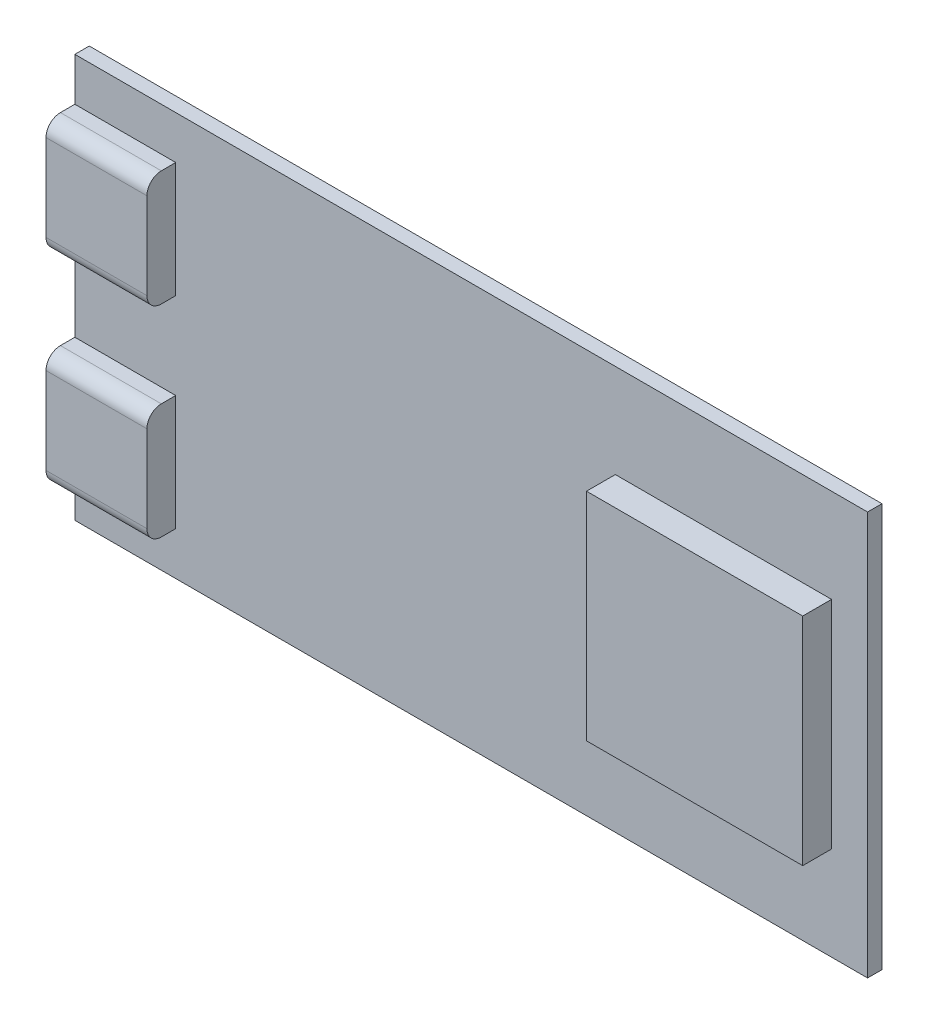
ISO-10303-21;
HEADER;
FILE_DESCRIPTION(('STEP AP214'),'2;1');
FILE_NAME('part.step','',(''),(''),'','','');
FILE_SCHEMA(('AUTOMOTIVE_DESIGN { 1 0 10303 214 1 1 1 1 }'));
ENDSEC;
DATA;
#1=APPLICATION_CONTEXT('core data for automotive mechanical design processes');
#2=APPLICATION_PROTOCOL_DEFINITION('international standard','automotive_design',2000,#1);
#3=PRODUCT_CONTEXT('',#1,'mechanical');
#4=PRODUCT('Part','Part','',(#3));
#5=PRODUCT_RELATED_PRODUCT_CATEGORY('part','',(#4));
#6=PRODUCT_DEFINITION_FORMATION('','',#4);
#7=PRODUCT_DEFINITION_CONTEXT('part definition',#1,'design');
#8=PRODUCT_DEFINITION('design','',#6,#7);
#9=PRODUCT_DEFINITION_SHAPE('','',#8);
#10=(LENGTH_UNIT() NAMED_UNIT(*) SI_UNIT(.MILLI.,.METRE.));
#11=(NAMED_UNIT(*) PLANE_ANGLE_UNIT() SI_UNIT($,.RADIAN.));
#12=(NAMED_UNIT(*) SI_UNIT($,.STERADIAN.) SOLID_ANGLE_UNIT());
#13=UNCERTAINTY_MEASURE_WITH_UNIT(LENGTH_MEASURE(1.E-05),#10,'distance_accuracy_value','');
#14=(GEOMETRIC_REPRESENTATION_CONTEXT(3) GLOBAL_UNCERTAINTY_ASSIGNED_CONTEXT((#13)) GLOBAL_UNIT_ASSIGNED_CONTEXT((#10,
#11,#12)) REPRESENTATION_CONTEXT('',''));
#15=CARTESIAN_POINT('',(0.,0.,0.));
#16=DIRECTION('',(0.,0.,1.));
#17=DIRECTION('',(1.,0.,0.));
#18=AXIS2_PLACEMENT_3D('',#15,#16,#17);
#19=CARTESIAN_POINT('',(0.,0.,1.));
#20=DIRECTION('',(0.,0.,1.));
#21=DIRECTION('',(1.,0.,0.));
#22=AXIS2_PLACEMENT_3D('',#19,#20,#21);
#23=PLANE('',#22);
#24=DIRECTION('',(1.,0.,0.));
#25=VECTOR('',#24,1.);
#26=CARTESIAN_POINT('',(25.,-7.5,1.));
#27=LINE('',#26,#25);
#28=CARTESIAN_POINT('',(9.99999999999999,-7.5,1.));
#29=VERTEX_POINT('',#28);
#30=CARTESIAN_POINT('',(25.,-7.5,1.));
#31=VERTEX_POINT('',#30);
#32=EDGE_CURVE('E255',#29,#31,#27,.T.);
#33=ORIENTED_EDGE('',*,*,#32,.F.);
#34=DIRECTION('',(0.,-1.,0.));
#35=VECTOR('',#34,1.);
#36=CARTESIAN_POINT('',(9.99999999999999,-7.5,1.));
#37=LINE('',#36,#35);
#38=CARTESIAN_POINT('',(9.99999999999999,7.5,1.));
#39=VERTEX_POINT('',#38);
#40=EDGE_CURVE('E241',#39,#29,#37,.T.);
#41=ORIENTED_EDGE('',*,*,#40,.F.);
#42=DIRECTION('',(-1.,0.,0.));
#43=VECTOR('',#42,1.);
#44=CARTESIAN_POINT('',(25.,7.5,1.));
#45=LINE('',#44,#43);
#46=CARTESIAN_POINT('',(25.,7.5,1.));
#47=VERTEX_POINT('',#46);
#48=EDGE_CURVE('E246',#47,#39,#45,.T.);
#49=ORIENTED_EDGE('',*,*,#48,.F.);
#50=DIRECTION('',(0.,1.,0.));
#51=VECTOR('',#50,1.);
#52=CARTESIAN_POINT('',(25.,-7.5,1.));
#53=LINE('',#52,#51);
#54=EDGE_CURVE('E257',#31,#47,#53,.T.);
#55=ORIENTED_EDGE('',*,*,#54,.F.);
#56=EDGE_LOOP('',(#33,#41,#49,#55));
#57=FACE_BOUND('',#56,.T.);
#58=DIRECTION('',(0.,-1.,0.));
#59=VECTOR('',#58,1.);
#60=CARTESIAN_POINT('',(-27.5,-14.,1.));
#61=LINE('',#60,#59);
#62=CARTESIAN_POINT('',(-27.5,3.,1.));
#63=VERTEX_POINT('',#62);
#64=CARTESIAN_POINT('',(-27.5,-3.,1.));
#65=VERTEX_POINT('',#64);
#66=EDGE_CURVE('E196',#63,#65,#61,.T.);
#67=ORIENTED_EDGE('',*,*,#66,.T.);
#68=DIRECTION('',(-1.,0.,0.));
#69=VECTOR('',#68,1.);
#70=CARTESIAN_POINT('',(-20.5,-3.,1.));
#71=LINE('',#70,#69);
#72=CARTESIAN_POINT('',(-20.5,-3.,1.));
#73=VERTEX_POINT('',#72);
#74=EDGE_CURVE('E205',#73,#65,#71,.T.);
#75=ORIENTED_EDGE('',*,*,#74,.F.);
#76=DIRECTION('',(0.,1.,0.));
#77=VECTOR('',#76,1.);
#78=CARTESIAN_POINT('',(-20.5,-3.,1.));
#79=LINE('',#78,#77);
#80=CARTESIAN_POINT('',(-20.5,-11.,1.));
#81=VERTEX_POINT('',#80);
#82=EDGE_CURVE('E204',#81,#73,#79,.T.);
#83=ORIENTED_EDGE('',*,*,#82,.F.);
#84=DIRECTION('',(1.,0.,0.));
#85=VECTOR('',#84,1.);
#86=CARTESIAN_POINT('',(-20.5,-11.,1.));
#87=LINE('',#86,#85);
#88=CARTESIAN_POINT('',(-27.5,-11.,1.));
#89=VERTEX_POINT('',#88);
#90=EDGE_CURVE('E180',#89,#81,#87,.T.);
#91=ORIENTED_EDGE('',*,*,#90,.F.);
#92=CARTESIAN_POINT('',(-27.5,-14.,1.));
#93=VERTEX_POINT('',#92);
#94=EDGE_CURVE('E189',#89,#93,#61,.T.);
#95=ORIENTED_EDGE('',*,*,#94,.T.);
#96=DIRECTION('',(1.,0.,0.));
#97=VECTOR('',#96,1.);
#98=CARTESIAN_POINT('',(27.5,-14.,1.));
#99=LINE('',#98,#97);
#100=CARTESIAN_POINT('',(27.5,-14.,1.));
#101=VERTEX_POINT('',#100);
#102=EDGE_CURVE('E272',#93,#101,#99,.T.);
#103=ORIENTED_EDGE('',*,*,#102,.T.);
#104=DIRECTION('',(0.,1.,0.));
#105=VECTOR('',#104,1.);
#106=CARTESIAN_POINT('',(27.5,-14.,1.));
#107=LINE('',#106,#105);
#108=CARTESIAN_POINT('',(27.5,14.,1.));
#109=VERTEX_POINT('',#108);
#110=EDGE_CURVE('E274',#101,#109,#107,.T.);
#111=ORIENTED_EDGE('',*,*,#110,.T.);
#112=DIRECTION('',(-1.,0.,0.));
#113=VECTOR('',#112,1.);
#114=CARTESIAN_POINT('',(27.5,14.,1.));
#115=LINE('',#114,#113);
#116=CARTESIAN_POINT('',(-27.5,14.,1.));
#117=VERTEX_POINT('',#116);
#118=EDGE_CURVE('E276',#109,#117,#115,.T.);
#119=ORIENTED_EDGE('',*,*,#118,.T.);
#120=CARTESIAN_POINT('',(-27.5,11.,1.));
#121=VERTEX_POINT('',#120);
#122=EDGE_CURVE('E199',#117,#121,#61,.T.);
#123=ORIENTED_EDGE('',*,*,#122,.T.);
#124=DIRECTION('',(-1.,0.,0.));
#125=VECTOR('',#124,1.);
#126=CARTESIAN_POINT('',(-20.5,11.,1.));
#127=LINE('',#126,#125);
#128=CARTESIAN_POINT('',(-20.5,11.,1.));
#129=VERTEX_POINT('',#128);
#130=EDGE_CURVE('E223',#129,#121,#127,.T.);
#131=ORIENTED_EDGE('',*,*,#130,.F.);
#132=DIRECTION('',(0.,1.,0.));
#133=VECTOR('',#132,1.);
#134=CARTESIAN_POINT('',(-20.5,3.,1.));
#135=LINE('',#134,#133);
#136=CARTESIAN_POINT('',(-20.5,3.,1.));
#137=VERTEX_POINT('',#136);
#138=EDGE_CURVE('E229',#137,#129,#135,.T.);
#139=ORIENTED_EDGE('',*,*,#138,.F.);
#140=DIRECTION('',(1.,0.,0.));
#141=VECTOR('',#140,1.);
#142=CARTESIAN_POINT('',(-20.5,3.,1.));
#143=LINE('',#142,#141);
#144=EDGE_CURVE('E216',#63,#137,#143,.T.);
#145=ORIENTED_EDGE('',*,*,#144,.F.);
#146=EDGE_LOOP('',(#67,#75,#83,#91,#95,#103,#111,#119,#123,#131,#139,#145));
#147=FACE_BOUND('',#146,.T.);
#148=ADVANCED_FACE('F39',(#57,#147),#23,.T.);
#149=CARTESIAN_POINT('',(-27.5,-14.,1.));
#150=DIRECTION('',(1.,0.,0.));
#151=DIRECTION('',(0.,0.,-1.));
#152=AXIS2_PLACEMENT_3D('',#149,#150,#151);
#153=PLANE('',#152);
#154=DIRECTION('',(0.,0.,-1.));
#155=VECTOR('',#154,1.);
#156=CARTESIAN_POINT('',(-27.5,-11.,3.));
#157=LINE('',#156,#155);
#158=CARTESIAN_POINT('',(-27.5,-11.,2.));
#159=VERTEX_POINT('',#158);
#160=EDGE_CURVE('E175',#159,#89,#157,.T.);
#161=ORIENTED_EDGE('',*,*,#160,.F.);
#162=CARTESIAN_POINT('',(-27.5,-10.,2.));
#163=DIRECTION('',(1.,0.,0.));
#164=DIRECTION('',(0.,0.,-1.));
#165=AXIS2_PLACEMENT_3D('',#162,#163,#164);
#166=CIRCLE('',#165,1.);
#167=CARTESIAN_POINT('',(-27.5,-10.,3.));
#168=VERTEX_POINT('',#167);
#169=EDGE_CURVE('E311',#159,#168,#166,.F.);
#170=ORIENTED_EDGE('',*,*,#169,.T.);
#171=DIRECTION('',(0.,-1.,0.));
#172=VECTOR('',#171,1.);
#173=CARTESIAN_POINT('',(-27.5,-3.,3.));
#174=LINE('',#173,#172);
#175=CARTESIAN_POINT('',(-27.5,-4.,3.));
#176=VERTEX_POINT('',#175);
#177=EDGE_CURVE('E211',#176,#168,#174,.T.);
#178=ORIENTED_EDGE('',*,*,#177,.F.);
#179=CARTESIAN_POINT('',(-27.5,-4.,2.));
#180=DIRECTION('',(1.,0.,0.));
#181=DIRECTION('',(0.,0.,-1.));
#182=AXIS2_PLACEMENT_3D('',#179,#180,#181);
#183=CIRCLE('',#182,1.);
#184=CARTESIAN_POINT('',(-27.5,-3.,2.));
#185=VERTEX_POINT('',#184);
#186=EDGE_CURVE('E309',#176,#185,#183,.F.);
#187=ORIENTED_EDGE('',*,*,#186,.T.);
#188=DIRECTION('',(0.,0.,-1.));
#189=VECTOR('',#188,1.);
#190=CARTESIAN_POINT('',(-27.5,-3.,3.));
#191=LINE('',#190,#189);
#192=EDGE_CURVE('E186',#185,#65,#191,.T.);
#193=ORIENTED_EDGE('',*,*,#192,.T.);
#194=ORIENTED_EDGE('',*,*,#66,.F.);
#195=DIRECTION('',(0.,0.,-1.));
#196=VECTOR('',#195,1.);
#197=CARTESIAN_POINT('',(-27.5,3.,3.));
#198=LINE('',#197,#196);
#199=CARTESIAN_POINT('',(-27.5,3.,2.));
#200=VERTEX_POINT('',#199);
#201=EDGE_CURVE('E239',#200,#63,#198,.T.);
#202=ORIENTED_EDGE('',*,*,#201,.F.);
#203=CARTESIAN_POINT('',(-27.5,4.,2.));
#204=DIRECTION('',(1.,0.,0.));
#205=DIRECTION('',(0.,0.,-1.));
#206=AXIS2_PLACEMENT_3D('',#203,#204,#205);
#207=CIRCLE('',#206,1.);
#208=CARTESIAN_POINT('',(-27.5,4.,3.));
#209=VERTEX_POINT('',#208);
#210=EDGE_CURVE('E307',#200,#209,#207,.F.);
#211=ORIENTED_EDGE('',*,*,#210,.T.);
#212=DIRECTION('',(0.,-1.,0.));
#213=VECTOR('',#212,1.);
#214=CARTESIAN_POINT('',(-27.5,3.,3.));
#215=LINE('',#214,#213);
#216=CARTESIAN_POINT('',(-27.5,10.,3.));
#217=VERTEX_POINT('',#216);
#218=EDGE_CURVE('E219',#217,#209,#215,.T.);
#219=ORIENTED_EDGE('',*,*,#218,.F.);
#220=CARTESIAN_POINT('',(-27.5,10.,2.));
#221=DIRECTION('',(1.,0.,0.));
#222=DIRECTION('',(0.,0.,-1.));
#223=AXIS2_PLACEMENT_3D('',#220,#221,#222);
#224=CIRCLE('',#223,1.);
#225=CARTESIAN_POINT('',(-27.5,11.,2.));
#226=VERTEX_POINT('',#225);
#227=EDGE_CURVE('E305',#217,#226,#224,.F.);
#228=ORIENTED_EDGE('',*,*,#227,.T.);
#229=DIRECTION('',(0.,0.,-1.));
#230=VECTOR('',#229,1.);
#231=CARTESIAN_POINT('',(-27.5,11.,3.));
#232=LINE('',#231,#230);
#233=EDGE_CURVE('E226',#226,#121,#232,.T.);
#234=ORIENTED_EDGE('',*,*,#233,.T.);
#235=ORIENTED_EDGE('',*,*,#122,.F.);
#236=DIRECTION('',(0.,0.,-1.));
#237=VECTOR('',#236,1.);
#238=CARTESIAN_POINT('',(-27.5,14.,1.));
#239=LINE('',#238,#237);
#240=CARTESIAN_POINT('',(-27.5,14.,0.));
#241=VERTEX_POINT('',#240);
#242=EDGE_CURVE('E278',#117,#241,#239,.T.);
#243=ORIENTED_EDGE('',*,*,#242,.T.);
#244=DIRECTION('',(0.,-1.,0.));
#245=VECTOR('',#244,1.);
#246=CARTESIAN_POINT('',(-27.5,-14.,0.));
#247=LINE('',#246,#245);
#248=CARTESIAN_POINT('',(-27.5,-14.,0.));
#249=VERTEX_POINT('',#248);
#250=EDGE_CURVE('E269',#241,#249,#247,.T.);
#251=ORIENTED_EDGE('',*,*,#250,.T.);
#252=DIRECTION('',(0.,0.,-1.));
#253=VECTOR('',#252,1.);
#254=CARTESIAN_POINT('',(-27.5,-14.,1.));
#255=LINE('',#254,#253);
#256=EDGE_CURVE('E193',#93,#249,#255,.T.);
#257=ORIENTED_EDGE('',*,*,#256,.F.);
#258=ORIENTED_EDGE('',*,*,#94,.F.);
#259=EDGE_LOOP('',(#161,#170,#178,#187,#193,#194,#202,#211,#219,#228,#234,#235,#243,#251,#257,#258));
#260=FACE_BOUND('',#259,.T.);
#261=ADVANCED_FACE('F190',(#260),#153,.F.);
#262=CARTESIAN_POINT('',(27.5,-14.,1.));
#263=DIRECTION('',(0.,1.,0.));
#264=DIRECTION('',(-1.,0.,0.));
#265=AXIS2_PLACEMENT_3D('',#262,#263,#264);
#266=PLANE('',#265);
#267=DIRECTION('',(1.,0.,0.));
#268=VECTOR('',#267,1.);
#269=CARTESIAN_POINT('',(27.5,-14.,0.));
#270=LINE('',#269,#268);
#271=CARTESIAN_POINT('',(27.5,-14.,0.));
#272=VERTEX_POINT('',#271);
#273=EDGE_CURVE('E280',#249,#272,#270,.T.);
#274=ORIENTED_EDGE('',*,*,#273,.T.);
#275=DIRECTION('',(0.,0.,-1.));
#276=VECTOR('',#275,1.);
#277=CARTESIAN_POINT('',(27.5,-14.,1.));
#278=LINE('',#277,#276);
#279=EDGE_CURVE('E290',#101,#272,#278,.T.);
#280=ORIENTED_EDGE('',*,*,#279,.F.);
#281=ORIENTED_EDGE('',*,*,#102,.F.);
#282=ORIENTED_EDGE('',*,*,#256,.T.);
#283=EDGE_LOOP('',(#274,#280,#281,#282));
#284=FACE_BOUND('',#283,.T.);
#285=ADVANCED_FACE('F354',(#284),#266,.F.);
#286=CARTESIAN_POINT('',(27.5,-14.,1.));
#287=DIRECTION('',(-1.,0.,0.));
#288=DIRECTION('',(0.,0.,1.));
#289=AXIS2_PLACEMENT_3D('',#286,#287,#288);
#290=PLANE('',#289);
#291=DIRECTION('',(0.,1.,0.));
#292=VECTOR('',#291,1.);
#293=CARTESIAN_POINT('',(27.5,-14.,0.));
#294=LINE('',#293,#292);
#295=CARTESIAN_POINT('',(27.5,14.,0.));
#296=VERTEX_POINT('',#295);
#297=EDGE_CURVE('E282',#272,#296,#294,.T.);
#298=ORIENTED_EDGE('',*,*,#297,.T.);
#299=DIRECTION('',(0.,0.,-1.));
#300=VECTOR('',#299,1.);
#301=CARTESIAN_POINT('',(27.5,14.,1.));
#302=LINE('',#301,#300);
#303=EDGE_CURVE('E287',#109,#296,#302,.T.);
#304=ORIENTED_EDGE('',*,*,#303,.F.);
#305=ORIENTED_EDGE('',*,*,#110,.F.);
#306=ORIENTED_EDGE('',*,*,#279,.T.);
#307=EDGE_LOOP('',(#298,#304,#305,#306));
#308=FACE_BOUND('',#307,.T.);
#309=ADVANCED_FACE('F358',(#308),#290,.F.);
#310=CARTESIAN_POINT('',(27.5,14.,1.));
#311=DIRECTION('',(0.,-1.,0.));
#312=DIRECTION('',(1.,0.,0.));
#313=AXIS2_PLACEMENT_3D('',#310,#311,#312);
#314=PLANE('',#313);
#315=DIRECTION('',(-1.,0.,0.));
#316=VECTOR('',#315,1.);
#317=CARTESIAN_POINT('',(27.5,14.,0.));
#318=LINE('',#317,#316);
#319=EDGE_CURVE('E197',#296,#241,#318,.T.);
#320=ORIENTED_EDGE('',*,*,#319,.T.);
#321=ORIENTED_EDGE('',*,*,#242,.F.);
#322=ORIENTED_EDGE('',*,*,#118,.F.);
#323=ORIENTED_EDGE('',*,*,#303,.T.);
#324=EDGE_LOOP('',(#320,#321,#322,#323));
#325=FACE_BOUND('',#324,.T.);
#326=ADVANCED_FACE('F359',(#325),#314,.F.);
#327=CARTESIAN_POINT('',(0.,0.,0.));
#328=DIRECTION('',(0.,0.,1.));
#329=DIRECTION('',(1.,0.,0.));
#330=AXIS2_PLACEMENT_3D('',#327,#328,#329);
#331=PLANE('',#330);
#332=ORIENTED_EDGE('',*,*,#250,.F.);
#333=ORIENTED_EDGE('',*,*,#319,.F.);
#334=ORIENTED_EDGE('',*,*,#297,.F.);
#335=ORIENTED_EDGE('',*,*,#273,.F.);
#336=EDGE_LOOP('',(#332,#333,#334,#335));
#337=FACE_BOUND('',#336,.T.);
#338=ADVANCED_FACE('F350',(#337),#331,.F.);
#339=CARTESIAN_POINT('',(9.99999999999999,-7.5,3.));
#340=DIRECTION('',(1.,0.,0.));
#341=DIRECTION('',(0.,0.,-1.));
#342=AXIS2_PLACEMENT_3D('',#339,#340,#341);
#343=PLANE('',#342);
#344=ORIENTED_EDGE('',*,*,#40,.T.);
#345=DIRECTION('',(0.,0.,-1.));
#346=VECTOR('',#345,1.);
#347=CARTESIAN_POINT('',(9.99999999999999,-7.5,3.));
#348=LINE('',#347,#346);
#349=CARTESIAN_POINT('',(9.99999999999999,-7.5,3.));
#350=VERTEX_POINT('',#349);
#351=EDGE_CURVE('E268',#350,#29,#348,.T.);
#352=ORIENTED_EDGE('',*,*,#351,.F.);
#353=DIRECTION('',(0.,-1.,0.));
#354=VECTOR('',#353,1.);
#355=CARTESIAN_POINT('',(9.99999999999999,-7.5,3.));
#356=LINE('',#355,#354);
#357=CARTESIAN_POINT('',(9.99999999999999,7.5,3.));
#358=VERTEX_POINT('',#357);
#359=EDGE_CURVE('E242',#358,#350,#356,.T.);
#360=ORIENTED_EDGE('',*,*,#359,.F.);
#361=DIRECTION('',(0.,0.,-1.));
#362=VECTOR('',#361,1.);
#363=CARTESIAN_POINT('',(9.99999999999999,7.5,3.));
#364=LINE('',#363,#362);
#365=EDGE_CURVE('E252',#358,#39,#364,.T.);
#366=ORIENTED_EDGE('',*,*,#365,.T.);
#367=EDGE_LOOP('',(#344,#352,#360,#366));
#368=FACE_BOUND('',#367,.T.);
#369=ADVANCED_FACE('F366',(#368),#343,.F.);
#370=CARTESIAN_POINT('',(25.,-7.5,3.));
#371=DIRECTION('',(0.,1.,0.));
#372=DIRECTION('',(-1.,0.,0.));
#373=AXIS2_PLACEMENT_3D('',#370,#371,#372);
#374=PLANE('',#373);
#375=ORIENTED_EDGE('',*,*,#32,.T.);
#376=DIRECTION('',(0.,0.,-1.));
#377=VECTOR('',#376,1.);
#378=CARTESIAN_POINT('',(25.,-7.5,3.));
#379=LINE('',#378,#377);
#380=CARTESIAN_POINT('',(25.,-7.5,3.));
#381=VERTEX_POINT('',#380);
#382=EDGE_CURVE('E265',#381,#31,#379,.T.);
#383=ORIENTED_EDGE('',*,*,#382,.F.);
#384=DIRECTION('',(1.,0.,0.));
#385=VECTOR('',#384,1.);
#386=CARTESIAN_POINT('',(25.,-7.5,3.));
#387=LINE('',#386,#385);
#388=EDGE_CURVE('E245',#350,#381,#387,.T.);
#389=ORIENTED_EDGE('',*,*,#388,.F.);
#390=ORIENTED_EDGE('',*,*,#351,.T.);
#391=EDGE_LOOP('',(#375,#383,#389,#390));
#392=FACE_BOUND('',#391,.T.);
#393=ADVANCED_FACE('F380',(#392),#374,.F.);
#394=CARTESIAN_POINT('',(25.,-7.5,3.));
#395=DIRECTION('',(-1.,0.,0.));
#396=DIRECTION('',(0.,0.,1.));
#397=AXIS2_PLACEMENT_3D('',#394,#395,#396);
#398=PLANE('',#397);
#399=ORIENTED_EDGE('',*,*,#54,.T.);
#400=DIRECTION('',(0.,0.,-1.));
#401=VECTOR('',#400,1.);
#402=CARTESIAN_POINT('',(25.,7.5,3.));
#403=LINE('',#402,#401);
#404=CARTESIAN_POINT('',(25.,7.5,3.));
#405=VERTEX_POINT('',#404);
#406=EDGE_CURVE('E263',#405,#47,#403,.T.);
#407=ORIENTED_EDGE('',*,*,#406,.F.);
#408=DIRECTION('',(0.,1.,0.));
#409=VECTOR('',#408,1.);
#410=CARTESIAN_POINT('',(25.,-7.5,3.));
#411=LINE('',#410,#409);
#412=EDGE_CURVE('E248',#381,#405,#411,.T.);
#413=ORIENTED_EDGE('',*,*,#412,.F.);
#414=ORIENTED_EDGE('',*,*,#382,.T.);
#415=EDGE_LOOP('',(#399,#407,#413,#414));
#416=FACE_BOUND('',#415,.T.);
#417=ADVANCED_FACE('F384',(#416),#398,.F.);
#418=CARTESIAN_POINT('',(25.,7.5,3.));
#419=DIRECTION('',(0.,-1.,0.));
#420=DIRECTION('',(1.,0.,0.));
#421=AXIS2_PLACEMENT_3D('',#418,#419,#420);
#422=PLANE('',#421);
#423=ORIENTED_EDGE('',*,*,#48,.T.);
#424=ORIENTED_EDGE('',*,*,#365,.F.);
#425=DIRECTION('',(-1.,0.,0.));
#426=VECTOR('',#425,1.);
#427=CARTESIAN_POINT('',(25.,7.5,3.));
#428=LINE('',#427,#426);
#429=EDGE_CURVE('E250',#405,#358,#428,.T.);
#430=ORIENTED_EDGE('',*,*,#429,.F.);
#431=ORIENTED_EDGE('',*,*,#406,.T.);
#432=EDGE_LOOP('',(#423,#424,#430,#431));
#433=FACE_BOUND('',#432,.T.);
#434=ADVANCED_FACE('F388',(#433),#422,.F.);
#435=CARTESIAN_POINT('',(0.,0.,3.));
#436=DIRECTION('',(0.,0.,1.));
#437=DIRECTION('',(1.,0.,0.));
#438=AXIS2_PLACEMENT_3D('',#435,#436,#437);
#439=PLANE('',#438);
#440=ORIENTED_EDGE('',*,*,#359,.T.);
#441=ORIENTED_EDGE('',*,*,#388,.T.);
#442=ORIENTED_EDGE('',*,*,#412,.T.);
#443=ORIENTED_EDGE('',*,*,#429,.T.);
#444=EDGE_LOOP('',(#440,#441,#442,#443));
#445=FACE_BOUND('',#444,.T.);
#446=ADVANCED_FACE('F392',(#445),#439,.T.);
#447=CARTESIAN_POINT('',(-20.5,3.,3.));
#448=DIRECTION('',(0.,1.,0.));
#449=DIRECTION('',(-1.,0.,0.));
#450=AXIS2_PLACEMENT_3D('',#447,#448,#449);
#451=PLANE('',#450);
#452=DIRECTION('',(0.,0.,-1.));
#453=VECTOR('',#452,1.);
#454=CARTESIAN_POINT('',(-20.5,3.,3.));
#455=LINE('',#454,#453);
#456=CARTESIAN_POINT('',(-20.5,3.,2.));
#457=VERTEX_POINT('',#456);
#458=EDGE_CURVE('E237',#457,#137,#455,.T.);
#459=ORIENTED_EDGE('',*,*,#458,.F.);
#460=DIRECTION('',(1.,0.,0.));
#461=VECTOR('',#460,1.);
#462=CARTESIAN_POINT('',(-27.5,3.,2.));
#463=LINE('',#462,#461);
#464=EDGE_CURVE('E47',#457,#200,#463,.F.);
#465=ORIENTED_EDGE('',*,*,#464,.T.);
#466=ORIENTED_EDGE('',*,*,#201,.T.);
#467=ORIENTED_EDGE('',*,*,#144,.T.);
#468=EDGE_LOOP('',(#459,#465,#466,#467));
#469=FACE_BOUND('',#468,.T.);
#470=ADVANCED_FACE('F326',(#469),#451,.F.);
#471=CARTESIAN_POINT('',(-20.5,3.,3.));
#472=DIRECTION('',(-1.,0.,0.));
#473=DIRECTION('',(0.,0.,1.));
#474=AXIS2_PLACEMENT_3D('',#471,#472,#473);
#475=PLANE('',#474);
#476=DIRECTION('',(0.,1.,0.));
#477=VECTOR('',#476,1.);
#478=CARTESIAN_POINT('',(-20.5,3.,3.));
#479=LINE('',#478,#477);
#480=CARTESIAN_POINT('',(-20.5,4.,3.));
#481=VERTEX_POINT('',#480);
#482=CARTESIAN_POINT('',(-20.5,10.,3.));
#483=VERTEX_POINT('',#482);
#484=EDGE_CURVE('E222',#481,#483,#479,.T.);
#485=ORIENTED_EDGE('',*,*,#484,.F.);
#486=CARTESIAN_POINT('',(-20.5,4.,2.));
#487=DIRECTION('',(-1.,0.,0.));
#488=DIRECTION('',(0.,0.,1.));
#489=AXIS2_PLACEMENT_3D('',#486,#487,#488);
#490=CIRCLE('',#489,1.);
#491=EDGE_CURVE('E54',#481,#457,#490,.F.);
#492=ORIENTED_EDGE('',*,*,#491,.T.);
#493=ORIENTED_EDGE('',*,*,#458,.T.);
#494=ORIENTED_EDGE('',*,*,#138,.T.);
#495=DIRECTION('',(0.,0.,-1.));
#496=VECTOR('',#495,1.);
#497=CARTESIAN_POINT('',(-20.5,11.,3.));
#498=LINE('',#497,#496);
#499=CARTESIAN_POINT('',(-20.5,11.,2.));
#500=VERTEX_POINT('',#499);
#501=EDGE_CURVE('E235',#500,#129,#498,.T.);
#502=ORIENTED_EDGE('',*,*,#501,.F.);
#503=CARTESIAN_POINT('',(-20.5,10.,2.));
#504=DIRECTION('',(-1.,0.,0.));
#505=DIRECTION('',(0.,0.,1.));
#506=AXIS2_PLACEMENT_3D('',#503,#504,#505);
#507=CIRCLE('',#506,1.);
#508=EDGE_CURVE('E321',#500,#483,#507,.F.);
#509=ORIENTED_EDGE('',*,*,#508,.T.);
#510=EDGE_LOOP('',(#485,#492,#493,#494,#502,#509));
#511=FACE_BOUND('',#510,.T.);
#512=ADVANCED_FACE('F337',(#511),#475,.F.);
#513=CARTESIAN_POINT('',(-20.5,11.,3.));
#514=DIRECTION('',(0.,-1.,0.));
#515=DIRECTION('',(1.,0.,0.));
#516=AXIS2_PLACEMENT_3D('',#513,#514,#515);
#517=PLANE('',#516);
#518=ORIENTED_EDGE('',*,*,#233,.F.);
#519=DIRECTION('',(-1.,0.,0.));
#520=VECTOR('',#519,1.);
#521=CARTESIAN_POINT('',(-20.5,11.,2.));
#522=LINE('',#521,#520);
#523=EDGE_CURVE('E11',#226,#500,#522,.F.);
#524=ORIENTED_EDGE('',*,*,#523,.T.);
#525=ORIENTED_EDGE('',*,*,#501,.T.);
#526=ORIENTED_EDGE('',*,*,#130,.T.);
#527=EDGE_LOOP('',(#518,#524,#525,#526));
#528=FACE_BOUND('',#527,.T.);
#529=ADVANCED_FACE('F341',(#528),#517,.F.);
#530=CARTESIAN_POINT('',(0.,0.,3.));
#531=DIRECTION('',(0.,0.,1.));
#532=DIRECTION('',(1.,0.,0.));
#533=AXIS2_PLACEMENT_3D('',#530,#531,#532);
#534=PLANE('',#533);
#535=ORIENTED_EDGE('',*,*,#218,.T.);
#536=DIRECTION('',(1.,0.,0.));
#537=VECTOR('',#536,1.);
#538=CARTESIAN_POINT('',(-20.5,4.,3.));
#539=LINE('',#538,#537);
#540=EDGE_CURVE('E318',#209,#481,#539,.T.);
#541=ORIENTED_EDGE('',*,*,#540,.T.);
#542=ORIENTED_EDGE('',*,*,#484,.T.);
#543=DIRECTION('',(-1.,0.,0.));
#544=VECTOR('',#543,1.);
#545=CARTESIAN_POINT('',(-27.5,10.,3.));
#546=LINE('',#545,#544);
#547=EDGE_CURVE('E315',#483,#217,#546,.T.);
#548=ORIENTED_EDGE('',*,*,#547,.T.);
#549=EDGE_LOOP('',(#535,#541,#542,#548));
#550=FACE_BOUND('',#549,.T.);
#551=ADVANCED_FACE('F335',(#550),#534,.T.);
#552=CARTESIAN_POINT('',(-20.5,-3.,3.));
#553=DIRECTION('',(-1.,0.,0.));
#554=DIRECTION('',(0.,-1.,0.));
#555=AXIS2_PLACEMENT_3D('',#552,#553,#554);
#556=PLANE('',#555);
#557=DIRECTION('',(0.,1.,0.));
#558=VECTOR('',#557,1.);
#559=CARTESIAN_POINT('',(-20.5,-3.,3.));
#560=LINE('',#559,#558);
#561=CARTESIAN_POINT('',(-20.5,-10.,3.));
#562=VERTEX_POINT('',#561);
#563=CARTESIAN_POINT('',(-20.5,-4.,3.));
#564=VERTEX_POINT('',#563);
#565=EDGE_CURVE('E206',#562,#564,#560,.T.);
#566=ORIENTED_EDGE('',*,*,#565,.F.);
#567=CARTESIAN_POINT('',(-20.5,-10.,2.));
#568=DIRECTION('',(-1.,0.,0.));
#569=DIRECTION('',(0.,-1.,0.));
#570=AXIS2_PLACEMENT_3D('',#567,#568,#569);
#571=CIRCLE('',#570,1.);
#572=CARTESIAN_POINT('',(-20.5,-11.,2.));
#573=VERTEX_POINT('',#572);
#574=EDGE_CURVE('E302',#562,#573,#571,.F.);
#575=ORIENTED_EDGE('',*,*,#574,.T.);
#576=DIRECTION('',(0.,0.,-1.));
#577=VECTOR('',#576,1.);
#578=CARTESIAN_POINT('',(-20.5,-11.,3.));
#579=LINE('',#578,#577);
#580=EDGE_CURVE('E185',#573,#81,#579,.T.);
#581=ORIENTED_EDGE('',*,*,#580,.T.);
#582=ORIENTED_EDGE('',*,*,#82,.T.);
#583=DIRECTION('',(0.,0.,-1.));
#584=VECTOR('',#583,1.);
#585=CARTESIAN_POINT('',(-20.5,-3.,3.));
#586=LINE('',#585,#584);
#587=CARTESIAN_POINT('',(-20.5,-3.,2.));
#588=VERTEX_POINT('',#587);
#589=EDGE_CURVE('E431',#588,#73,#586,.T.);
#590=ORIENTED_EDGE('',*,*,#589,.F.);
#591=CARTESIAN_POINT('',(-20.5,-4.,2.));
#592=DIRECTION('',(-1.,0.,0.));
#593=DIRECTION('',(0.,-1.,0.));
#594=AXIS2_PLACEMENT_3D('',#591,#592,#593);
#595=CIRCLE('',#594,1.);
#596=EDGE_CURVE('E300',#588,#564,#595,.F.);
#597=ORIENTED_EDGE('',*,*,#596,.T.);
#598=EDGE_LOOP('',(#566,#575,#581,#582,#590,#597));
#599=FACE_BOUND('',#598,.T.);
#600=ADVANCED_FACE('F405',(#599),#556,.F.);
#601=CARTESIAN_POINT('',(-20.5,-3.,3.));
#602=DIRECTION('',(0.,-1.,0.));
#603=DIRECTION('',(1.,0.,0.));
#604=AXIS2_PLACEMENT_3D('',#601,#602,#603);
#605=PLANE('',#604);
#606=ORIENTED_EDGE('',*,*,#192,.F.);
#607=DIRECTION('',(-1.,0.,0.));
#608=VECTOR('',#607,1.);
#609=CARTESIAN_POINT('',(-20.5,-3.,2.));
#610=LINE('',#609,#608);
#611=EDGE_CURVE('E313',#185,#588,#610,.F.);
#612=ORIENTED_EDGE('',*,*,#611,.T.);
#613=ORIENTED_EDGE('',*,*,#589,.T.);
#614=ORIENTED_EDGE('',*,*,#74,.T.);
#615=EDGE_LOOP('',(#606,#612,#613,#614));
#616=FACE_BOUND('',#615,.T.);
#617=ADVANCED_FACE('F413',(#616),#605,.F.);
#618=CARTESIAN_POINT('',(-20.5,-11.,3.));
#619=DIRECTION('',(0.,1.,0.));
#620=DIRECTION('',(-1.,0.,0.));
#621=AXIS2_PLACEMENT_3D('',#618,#619,#620);
#622=PLANE('',#621);
#623=ORIENTED_EDGE('',*,*,#580,.F.);
#624=DIRECTION('',(1.,0.,0.));
#625=VECTOR('',#624,1.);
#626=CARTESIAN_POINT('',(-20.5,-11.,2.));
#627=LINE('',#626,#625);
#628=EDGE_CURVE('E182',#573,#159,#627,.F.);
#629=ORIENTED_EDGE('',*,*,#628,.T.);
#630=ORIENTED_EDGE('',*,*,#160,.T.);
#631=ORIENTED_EDGE('',*,*,#90,.T.);
#632=EDGE_LOOP('',(#623,#629,#630,#631));
#633=FACE_BOUND('',#632,.T.);
#634=ADVANCED_FACE('F178',(#633),#622,.F.);
#635=CARTESIAN_POINT('',(0.,0.,3.));
#636=DIRECTION('',(0.,0.,-1.));
#637=DIRECTION('',(-1.,0.,0.));
#638=AXIS2_PLACEMENT_3D('',#635,#636,#637);
#639=PLANE('',#638);
#640=ORIENTED_EDGE('',*,*,#177,.T.);
#641=DIRECTION('',(1.,0.,0.));
#642=VECTOR('',#641,1.);
#643=CARTESIAN_POINT('',(0.,-9.99999999999998,3.));
#644=LINE('',#643,#642);
#645=EDGE_CURVE('E297',#168,#562,#644,.T.);
#646=ORIENTED_EDGE('',*,*,#645,.T.);
#647=ORIENTED_EDGE('',*,*,#565,.T.);
#648=DIRECTION('',(-1.,0.,0.));
#649=VECTOR('',#648,1.);
#650=CARTESIAN_POINT('',(0.,-4.,3.));
#651=LINE('',#650,#649);
#652=EDGE_CURVE('E294',#564,#176,#651,.T.);
#653=ORIENTED_EDGE('',*,*,#652,.T.);
#654=EDGE_LOOP('',(#640,#646,#647,#653));
#655=FACE_BOUND('',#654,.T.);
#656=ADVANCED_FACE('F406',(#655),#639,.F.);
#657=CARTESIAN_POINT('',(0.,-9.99999999999998,2.));
#658=DIRECTION('',(1.,0.,0.));
#659=DIRECTION('',(0.,1.,0.));
#660=AXIS2_PLACEMENT_3D('',#657,#658,#659);
#661=CYLINDRICAL_SURFACE('',#660,1.);
#662=ORIENTED_EDGE('',*,*,#169,.F.);
#663=ORIENTED_EDGE('',*,*,#628,.F.);
#664=ORIENTED_EDGE('',*,*,#574,.F.);
#665=ORIENTED_EDGE('',*,*,#645,.F.);
#666=EDGE_LOOP('',(#662,#663,#664,#665));
#667=FACE_BOUND('',#666,.T.);
#668=ADVANCED_FACE('F409',(#667),#661,.T.);
#669=CARTESIAN_POINT('',(0.,-4.,2.));
#670=DIRECTION('',(-1.,0.,0.));
#671=DIRECTION('',(0.,-1.,0.));
#672=AXIS2_PLACEMENT_3D('',#669,#670,#671);
#673=CYLINDRICAL_SURFACE('',#672,1.);
#674=ORIENTED_EDGE('',*,*,#596,.F.);
#675=ORIENTED_EDGE('',*,*,#611,.F.);
#676=ORIENTED_EDGE('',*,*,#186,.F.);
#677=ORIENTED_EDGE('',*,*,#652,.F.);
#678=EDGE_LOOP('',(#674,#675,#676,#677));
#679=FACE_BOUND('',#678,.T.);
#680=ADVANCED_FACE('F428',(#679),#673,.T.);
#681=CARTESIAN_POINT('',(0.,4.,2.));
#682=DIRECTION('',(-1.,0.,0.));
#683=DIRECTION('',(0.,-1.,0.));
#684=AXIS2_PLACEMENT_3D('',#681,#682,#683);
#685=CYLINDRICAL_SURFACE('',#684,1.);
#686=ORIENTED_EDGE('',*,*,#210,.F.);
#687=ORIENTED_EDGE('',*,*,#464,.F.);
#688=ORIENTED_EDGE('',*,*,#491,.F.);
#689=ORIENTED_EDGE('',*,*,#540,.F.);
#690=EDGE_LOOP('',(#686,#687,#688,#689));
#691=FACE_BOUND('',#690,.T.);
#692=ADVANCED_FACE('F333',(#691),#685,.T.);
#693=CARTESIAN_POINT('',(0.,9.99999999999999,2.));
#694=DIRECTION('',(1.,0.,0.));
#695=DIRECTION('',(0.,1.,0.));
#696=AXIS2_PLACEMENT_3D('',#693,#694,#695);
#697=CYLINDRICAL_SURFACE('',#696,1.);
#698=ORIENTED_EDGE('',*,*,#508,.F.);
#699=ORIENTED_EDGE('',*,*,#523,.F.);
#700=ORIENTED_EDGE('',*,*,#227,.F.);
#701=ORIENTED_EDGE('',*,*,#547,.F.);
#702=EDGE_LOOP('',(#698,#699,#700,#701));
#703=FACE_BOUND('',#702,.T.);
#704=ADVANCED_FACE('F41',(#703),#697,.T.);
#705=CLOSED_SHELL('',(#148,#261,#285,#309,#326,#338,#369,#393,#417,#434,#446,#470,#512,#529,
#551,#600,#617,#634,#656,#668,#680,#692,#704));
#706=MANIFOLD_SOLID_BREP('B2',#705);
#707=ADVANCED_BREP_SHAPE_REPRESENTATION('',(#18,#706),#14);
#708=SHAPE_DEFINITION_REPRESENTATION(#9,#707);
ENDSEC;
END-ISO-10303-21;
